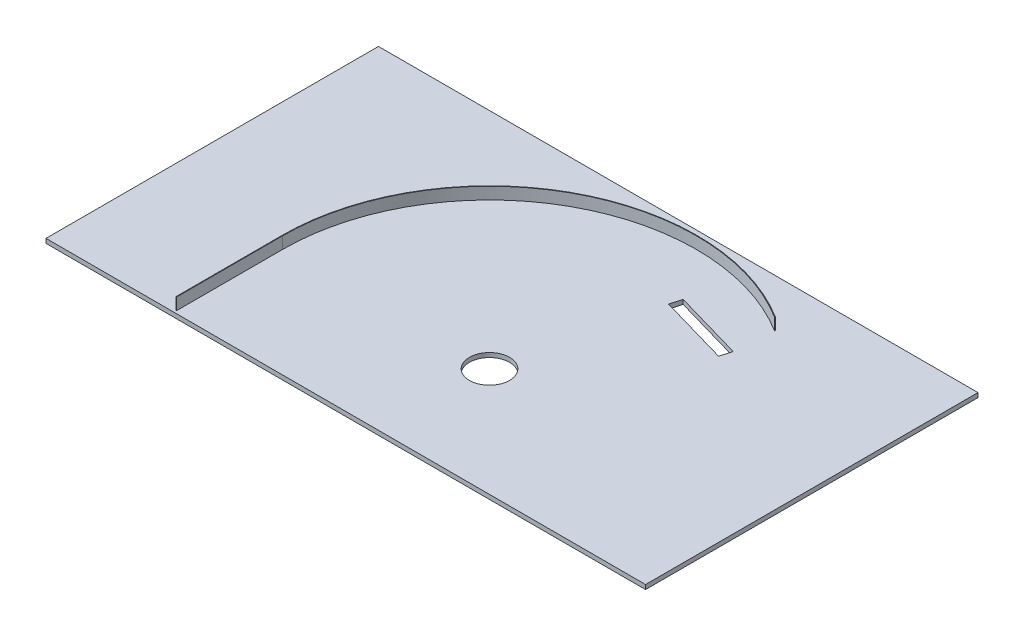
ISO-10303-21;
HEADER;
FILE_DESCRIPTION(('STEP AP214'),'2;1');
FILE_NAME('part.step','',(''),(''),'','','');
FILE_SCHEMA(('AUTOMOTIVE_DESIGN { 1 0 10303 214 1 1 1 1 }'));
ENDSEC;
DATA;
#1=APPLICATION_CONTEXT('core data for automotive mechanical design processes');
#2=APPLICATION_PROTOCOL_DEFINITION('international standard','automotive_design',2000,#1);
#3=PRODUCT_CONTEXT('',#1,'mechanical');
#4=PRODUCT('Part','Part','',(#3));
#5=PRODUCT_RELATED_PRODUCT_CATEGORY('part','',(#4));
#6=PRODUCT_DEFINITION_FORMATION('','',#4);
#7=PRODUCT_DEFINITION_CONTEXT('part definition',#1,'design');
#8=PRODUCT_DEFINITION('design','',#6,#7);
#9=PRODUCT_DEFINITION_SHAPE('','',#8);
#10=(LENGTH_UNIT() NAMED_UNIT(*) SI_UNIT(.MILLI.,.METRE.));
#11=(NAMED_UNIT(*) PLANE_ANGLE_UNIT() SI_UNIT($,.RADIAN.));
#12=(NAMED_UNIT(*) SI_UNIT($,.STERADIAN.) SOLID_ANGLE_UNIT());
#13=UNCERTAINTY_MEASURE_WITH_UNIT(LENGTH_MEASURE(1.E-05),#10,'distance_accuracy_value','');
#14=(GEOMETRIC_REPRESENTATION_CONTEXT(3) GLOBAL_UNCERTAINTY_ASSIGNED_CONTEXT((#13)) GLOBAL_UNIT_ASSIGNED_CONTEXT((#10,
#11,#12)) REPRESENTATION_CONTEXT('',''));
#15=CARTESIAN_POINT('',(0.,0.,0.));
#16=DIRECTION('',(0.,0.,1.));
#17=DIRECTION('',(1.,0.,0.));
#18=AXIS2_PLACEMENT_3D('',#15,#16,#17);
#19=CARTESIAN_POINT('',(0.,0.,0.));
#20=DIRECTION('',(0.,1.,0.));
#21=DIRECTION('',(0.,0.,1.));
#22=AXIS2_PLACEMENT_3D('',#19,#20,#21);
#23=PLANE('',#22);
#24=DIRECTION('',(0.275637355816992,0.,-0.961261695938321));
#25=VECTOR('',#24,1.);
#26=CARTESIAN_POINT('',(262.4,0.,-317.9));
#27=LINE('',#26,#25);
#28=CARTESIAN_POINT('',(262.4,0.,-317.9));
#29=VERTEX_POINT('',#28);
#30=CARTESIAN_POINT('',(270.66912067451,0.,-346.737850878149));
#31=VERTEX_POINT('',#30);
#32=EDGE_CURVE('E61',#29,#31,#27,.T.);
#33=ORIENTED_EDGE('',*,*,#32,.F.);
#34=DIRECTION('',(0.961261695938321,0.,0.275637355816993));
#35=VECTOR('',#34,1.);
#36=CARTESIAN_POINT('',(84.5665862514106,0.,-368.892910826144));
#37=LINE('',#36,#35);
#38=CARTESIAN_POINT('',(84.5665862514106,0.,-368.892910826144));
#39=VERTEX_POINT('',#38);
#40=EDGE_CURVE('E168',#39,#29,#37,.T.);
#41=ORIENTED_EDGE('',*,*,#40,.F.);
#42=DIRECTION('',(-0.275637355816993,0.,0.961261695938321));
#43=VECTOR('',#42,1.);
#44=CARTESIAN_POINT('',(92.8357069259204,0.,-397.730761704293));
#45=LINE('',#44,#43);
#46=CARTESIAN_POINT('',(92.8357069259204,0.,-397.730761704293));
#47=VERTEX_POINT('',#46);
#48=EDGE_CURVE('E172',#47,#39,#45,.T.);
#49=ORIENTED_EDGE('',*,*,#48,.F.);
#50=DIRECTION('',(-0.961261695938321,0.,-0.275637355816993));
#51=VECTOR('',#50,1.);
#52=CARTESIAN_POINT('',(270.66912067451,0.,-346.73785087815));
#53=LINE('',#52,#51);
#54=EDGE_CURVE('E181',#31,#47,#53,.T.);
#55=ORIENTED_EDGE('',*,*,#54,.F.);
#56=EDGE_LOOP('',(#33,#41,#49,#55));
#57=FACE_BOUND('',#56,.T.);
#58=CARTESIAN_POINT('',(0.,0.,0.));
#59=DIRECTION('',(0.,1.,0.));
#60=DIRECTION('',(0.,0.,1.));
#61=AXIS2_PLACEMENT_3D('',#58,#59,#60);
#62=CIRCLE('',#61,50.8);
#63=CARTESIAN_POINT('',(0.,0.,50.8));
#64=VERTEX_POINT('',#63);
#65=EDGE_CURVE('E200',#64,#64,#62,.T.);
#66=ORIENTED_EDGE('',*,*,#65,.F.);
#67=EDGE_LOOP('',(#66));
#68=FACE_BOUND('',#67,.T.);
#69=DIRECTION('',(0.,0.,1.));
#70=VECTOR('',#69,1.);
#71=CARTESIAN_POINT('',(-848.,0.,-566.7));
#72=LINE('',#71,#70);
#73=CARTESIAN_POINT('',(-848.,0.,-566.7));
#74=VERTEX_POINT('',#73);
#75=CARTESIAN_POINT('',(-848.,0.,275.4));
#76=VERTEX_POINT('',#75);
#77=EDGE_CURVE('E234',#74,#76,#72,.T.);
#78=ORIENTED_EDGE('',*,*,#77,.T.);
#79=DIRECTION('',(1.,0.,0.));
#80=VECTOR('',#79,1.);
#81=CARTESIAN_POINT('',(-848.,0.,275.4));
#82=LINE('',#81,#80);
#83=CARTESIAN_POINT('',(670.677694458201,0.,275.4));
#84=VERTEX_POINT('',#83);
#85=EDGE_CURVE('E256',#76,#84,#82,.T.);
#86=ORIENTED_EDGE('',*,*,#85,.T.);
#87=DIRECTION('',(0.,0.,-1.));
#88=VECTOR('',#87,1.);
#89=CARTESIAN_POINT('',(670.677694458201,0.,-566.7));
#90=LINE('',#89,#88);
#91=CARTESIAN_POINT('',(670.677694458201,0.,-566.7));
#92=VERTEX_POINT('',#91);
#93=EDGE_CURVE('E260',#84,#92,#90,.T.);
#94=ORIENTED_EDGE('',*,*,#93,.T.);
#95=DIRECTION('',(-1.,0.,0.));
#96=VECTOR('',#95,1.);
#97=CARTESIAN_POINT('',(-848.,0.,-566.7));
#98=LINE('',#97,#96);
#99=EDGE_CURVE('E240',#92,#74,#98,.T.);
#100=ORIENTED_EDGE('',*,*,#99,.T.);
#101=EDGE_LOOP('',(#78,#86,#94,#100));
#102=FACE_BOUND('',#101,.T.);
#103=DIRECTION('',(1.,0.,0.));
#104=VECTOR('',#103,1.);
#105=CARTESIAN_POINT('',(-525.5875,0.,269.05));
#106=LINE('',#105,#104);
#107=CARTESIAN_POINT('',(-525.5875,0.,269.05));
#108=VERTEX_POINT('',#107);
#109=CARTESIAN_POINT('',(-524.,0.,269.05));
#110=VERTEX_POINT('',#109);
#111=EDGE_CURVE('E201',#108,#110,#106,.T.);
#112=ORIENTED_EDGE('',*,*,#111,.F.);
#113=DIRECTION('',(0.,0.,-1.));
#114=VECTOR('',#113,1.);
#115=CARTESIAN_POINT('',(-525.5875,0.,299.091973241616));
#116=LINE('',#115,#114);
#117=CARTESIAN_POINT('',(-525.5875,0.,0.));
#118=VERTEX_POINT('',#117);
#119=EDGE_CURVE('E214',#108,#118,#116,.T.);
#120=ORIENTED_EDGE('',*,*,#119,.T.);
#121=CARTESIAN_POINT('',(0.,0.,0.));
#122=DIRECTION('',(0.,1.,0.));
#123=DIRECTION('',(0.,0.,1.));
#124=AXIS2_PLACEMENT_3D('',#121,#122,#123);
#125=CIRCLE('',#124,525.5875);
#126=CARTESIAN_POINT('',(277.677694458201,0.,-446.248045549365));
#127=VERTEX_POINT('',#126);
#128=EDGE_CURVE('E284',#127,#118,#125,.T.);
#129=ORIENTED_EDGE('',*,*,#128,.F.);
#130=DIRECTION('',(0.,0.,-1.));
#131=VECTOR('',#130,1.);
#132=CARTESIAN_POINT('',(277.677694458201,0.,-444.377202385966));
#133=LINE('',#132,#131);
#134=CARTESIAN_POINT('',(277.677694458201,0.,-444.377202385966));
#135=VERTEX_POINT('',#134);
#136=EDGE_CURVE('E294',#135,#127,#133,.T.);
#137=ORIENTED_EDGE('',*,*,#136,.F.);
#138=CARTESIAN_POINT('',(0.,0.,0.));
#139=DIRECTION('',(0.,-1.,0.));
#140=DIRECTION('',(0.,0.,1.));
#141=AXIS2_PLACEMENT_3D('',#138,#139,#140);
#142=CIRCLE('',#141,524.);
#143=CARTESIAN_POINT('',(-524.,0.,0.));
#144=VERTEX_POINT('',#143);
#145=EDGE_CURVE('E270',#144,#135,#142,.T.);
#146=ORIENTED_EDGE('',*,*,#145,.F.);
#147=DIRECTION('',(0.,0.,-1.));
#148=VECTOR('',#147,1.);
#149=CARTESIAN_POINT('',(-524.,0.,299.091973241616));
#150=LINE('',#149,#148);
#151=EDGE_CURVE('E217',#110,#144,#150,.T.);
#152=ORIENTED_EDGE('',*,*,#151,.F.);
#153=EDGE_LOOP('',(#112,#120,#129,#137,#146,#152));
#154=FACE_BOUND('',#153,.T.);
#155=ADVANCED_FACE('F45',(#57,#68,#102,#154),#23,.T.);
#156=CARTESIAN_POINT('',(0.,30.,0.));
#157=DIRECTION('',(0.,-1.,0.));
#158=DIRECTION('',(0.,0.,-1.));
#159=AXIS2_PLACEMENT_3D('',#156,#157,#158);
#160=CYLINDRICAL_SURFACE('',#159,524.);
#161=ORIENTED_EDGE('',*,*,#145,.T.);
#162=DIRECTION('',(0.,-1.,0.));
#163=VECTOR('',#162,1.);
#164=CARTESIAN_POINT('',(277.677694458201,30.,-444.377202385966));
#165=LINE('',#164,#163);
#166=CARTESIAN_POINT('',(277.677694458201,30.,-444.377202385966));
#167=VERTEX_POINT('',#166);
#168=EDGE_CURVE('E11',#167,#135,#165,.T.);
#169=ORIENTED_EDGE('',*,*,#168,.F.);
#170=CARTESIAN_POINT('',(0.,30.,0.));
#171=DIRECTION('',(0.,-1.,0.));
#172=DIRECTION('',(0.,0.,1.));
#173=AXIS2_PLACEMENT_3D('',#170,#171,#172);
#174=CIRCLE('',#173,524.);
#175=CARTESIAN_POINT('',(-524.,30.,0.));
#176=VERTEX_POINT('',#175);
#177=EDGE_CURVE('E279',#176,#167,#174,.T.);
#178=ORIENTED_EDGE('',*,*,#177,.F.);
#179=DIRECTION('',(0.,-1.,0.));
#180=VECTOR('',#179,1.);
#181=CARTESIAN_POINT('',(-524.,30.,0.));
#182=LINE('',#181,#180);
#183=EDGE_CURVE('E290',#176,#144,#182,.T.);
#184=ORIENTED_EDGE('',*,*,#183,.T.);
#185=EDGE_LOOP('',(#161,#169,#178,#184));
#186=FACE_BOUND('',#185,.T.);
#187=ADVANCED_FACE('F47',(#186),#160,.F.);
#188=CARTESIAN_POINT('',(277.677694458201,30.,-444.377202385966));
#189=DIRECTION('',(-1.,0.,0.));
#190=DIRECTION('',(0.,0.,1.));
#191=AXIS2_PLACEMENT_3D('',#188,#189,#190);
#192=PLANE('',#191);
#193=ORIENTED_EDGE('',*,*,#136,.T.);
#194=DIRECTION('',(0.,-1.,0.));
#195=VECTOR('',#194,1.);
#196=CARTESIAN_POINT('',(277.677694458201,30.,-446.248045549365));
#197=LINE('',#196,#195);
#198=CARTESIAN_POINT('',(277.677694458201,30.,-446.248045549365));
#199=VERTEX_POINT('',#198);
#200=EDGE_CURVE('E54',#199,#127,#197,.T.);
#201=ORIENTED_EDGE('',*,*,#200,.F.);
#202=DIRECTION('',(0.,0.,-1.));
#203=VECTOR('',#202,1.);
#204=CARTESIAN_POINT('',(277.677694458201,30.,-444.377202385966));
#205=LINE('',#204,#203);
#206=EDGE_CURVE('E283',#167,#199,#205,.T.);
#207=ORIENTED_EDGE('',*,*,#206,.F.);
#208=ORIENTED_EDGE('',*,*,#168,.T.);
#209=EDGE_LOOP('',(#193,#201,#207,#208));
#210=FACE_BOUND('',#209,.T.);
#211=ADVANCED_FACE('F315',(#210),#192,.F.);
#212=CARTESIAN_POINT('',(0.,30.,0.));
#213=DIRECTION('',(0.,-1.,0.));
#214=DIRECTION('',(0.,0.,-1.));
#215=AXIS2_PLACEMENT_3D('',#212,#213,#214);
#216=CYLINDRICAL_SURFACE('',#215,525.5875);
#217=ORIENTED_EDGE('',*,*,#128,.T.);
#218=DIRECTION('',(0.,-1.,0.));
#219=VECTOR('',#218,1.);
#220=CARTESIAN_POINT('',(-525.5875,30.,0.));
#221=LINE('',#220,#219);
#222=CARTESIAN_POINT('',(-525.5875,30.,0.));
#223=VERTEX_POINT('',#222);
#224=EDGE_CURVE('E304',#223,#118,#221,.T.);
#225=ORIENTED_EDGE('',*,*,#224,.F.);
#226=CARTESIAN_POINT('',(0.,30.,0.));
#227=DIRECTION('',(0.,1.,0.));
#228=DIRECTION('',(0.,0.,1.));
#229=AXIS2_PLACEMENT_3D('',#226,#227,#228);
#230=CIRCLE('',#229,525.5875);
#231=EDGE_CURVE('E287',#199,#223,#230,.T.);
#232=ORIENTED_EDGE('',*,*,#231,.F.);
#233=ORIENTED_EDGE('',*,*,#200,.T.);
#234=EDGE_LOOP('',(#217,#225,#232,#233));
#235=FACE_BOUND('',#234,.T.);
#236=ADVANCED_FACE('F312',(#235),#216,.T.);
#237=CARTESIAN_POINT('',(0.,30.,0.));
#238=DIRECTION('',(0.,1.,0.));
#239=DIRECTION('',(0.,0.,1.));
#240=AXIS2_PLACEMENT_3D('',#237,#238,#239);
#241=PLANE('',#240);
#242=ORIENTED_EDGE('',*,*,#177,.T.);
#243=ORIENTED_EDGE('',*,*,#206,.T.);
#244=ORIENTED_EDGE('',*,*,#231,.T.);
#245=DIRECTION('',(0.,0.,-1.));
#246=VECTOR('',#245,1.);
#247=CARTESIAN_POINT('',(-525.5875,30.,299.091973241616));
#248=LINE('',#247,#246);
#249=CARTESIAN_POINT('',(-525.5875,30.,269.05));
#250=VERTEX_POINT('',#249);
#251=EDGE_CURVE('E190',#250,#223,#248,.T.);
#252=ORIENTED_EDGE('',*,*,#251,.F.);
#253=DIRECTION('',(-1.,0.,0.));
#254=VECTOR('',#253,1.);
#255=CARTESIAN_POINT('',(-525.5875,30.,269.05));
#256=LINE('',#255,#254);
#257=CARTESIAN_POINT('',(-524.,30.,269.05));
#258=VERTEX_POINT('',#257);
#259=EDGE_CURVE('E209',#258,#250,#256,.T.);
#260=ORIENTED_EDGE('',*,*,#259,.F.);
#261=DIRECTION('',(0.,0.,-1.));
#262=VECTOR('',#261,1.);
#263=CARTESIAN_POINT('',(-524.,30.,299.091973241616));
#264=LINE('',#263,#262);
#265=EDGE_CURVE('E213',#258,#176,#264,.T.);
#266=ORIENTED_EDGE('',*,*,#265,.T.);
#267=EDGE_LOOP('',(#242,#243,#244,#252,#260,#266));
#268=FACE_BOUND('',#267,.T.);
#269=ADVANCED_FACE('F327',(#268),#241,.T.);
#270=CARTESIAN_POINT('',(-848.,-11.1125,-566.7));
#271=DIRECTION('',(-1.,0.,0.));
#272=DIRECTION('',(0.,0.,1.));
#273=AXIS2_PLACEMENT_3D('',#270,#271,#272);
#274=PLANE('',#273);
#275=ORIENTED_EDGE('',*,*,#77,.F.);
#276=DIRECTION('',(0.,1.,0.));
#277=VECTOR('',#276,1.);
#278=CARTESIAN_POINT('',(-848.,-11.1125,-566.7));
#279=LINE('',#278,#277);
#280=CARTESIAN_POINT('',(-848.,-11.1125,-566.7));
#281=VERTEX_POINT('',#280);
#282=EDGE_CURVE('E267',#281,#74,#279,.T.);
#283=ORIENTED_EDGE('',*,*,#282,.F.);
#284=DIRECTION('',(0.,0.,1.));
#285=VECTOR('',#284,1.);
#286=CARTESIAN_POINT('',(-848.,-11.1125,-566.7));
#287=LINE('',#286,#285);
#288=CARTESIAN_POINT('',(-848.,-11.1125,275.4));
#289=VERTEX_POINT('',#288);
#290=EDGE_CURVE('E235',#281,#289,#287,.T.);
#291=ORIENTED_EDGE('',*,*,#290,.T.);
#292=DIRECTION('',(0.,1.,0.));
#293=VECTOR('',#292,1.);
#294=CARTESIAN_POINT('',(-848.,-11.1125,275.4));
#295=LINE('',#294,#293);
#296=EDGE_CURVE('E252',#289,#76,#295,.T.);
#297=ORIENTED_EDGE('',*,*,#296,.T.);
#298=EDGE_LOOP('',(#275,#283,#291,#297));
#299=FACE_BOUND('',#298,.T.);
#300=ADVANCED_FACE('F357',(#299),#274,.T.);
#301=CARTESIAN_POINT('',(-848.,-11.1125,-566.7));
#302=DIRECTION('',(0.,0.,-1.));
#303=DIRECTION('',(-1.,0.,0.));
#304=AXIS2_PLACEMENT_3D('',#301,#302,#303);
#305=PLANE('',#304);
#306=ORIENTED_EDGE('',*,*,#99,.F.);
#307=DIRECTION('',(0.,1.,0.));
#308=VECTOR('',#307,1.);
#309=CARTESIAN_POINT('',(670.677694458201,-11.1125,-566.7));
#310=LINE('',#309,#308);
#311=CARTESIAN_POINT('',(670.677694458201,-11.1125,-566.7));
#312=VERTEX_POINT('',#311);
#313=EDGE_CURVE('E271',#312,#92,#310,.T.);
#314=ORIENTED_EDGE('',*,*,#313,.F.);
#315=DIRECTION('',(-1.,0.,0.));
#316=VECTOR('',#315,1.);
#317=CARTESIAN_POINT('',(-848.,-11.1125,-566.7));
#318=LINE('',#317,#316);
#319=EDGE_CURVE('E248',#312,#281,#318,.T.);
#320=ORIENTED_EDGE('',*,*,#319,.T.);
#321=ORIENTED_EDGE('',*,*,#282,.T.);
#322=EDGE_LOOP('',(#306,#314,#320,#321));
#323=FACE_BOUND('',#322,.T.);
#324=ADVANCED_FACE('F353',(#323),#305,.T.);
#325=CARTESIAN_POINT('',(670.677694458201,-11.1125,-566.7));
#326=DIRECTION('',(1.,0.,0.));
#327=DIRECTION('',(0.,0.,-1.));
#328=AXIS2_PLACEMENT_3D('',#325,#326,#327);
#329=PLANE('',#328);
#330=ORIENTED_EDGE('',*,*,#93,.F.);
#331=DIRECTION('',(0.,1.,0.));
#332=VECTOR('',#331,1.);
#333=CARTESIAN_POINT('',(670.677694458201,-11.1125,275.4));
#334=LINE('',#333,#332);
#335=CARTESIAN_POINT('',(670.677694458201,-11.1125,275.4));
#336=VERTEX_POINT('',#335);
#337=EDGE_CURVE('E274',#336,#84,#334,.T.);
#338=ORIENTED_EDGE('',*,*,#337,.F.);
#339=DIRECTION('',(0.,0.,-1.));
#340=VECTOR('',#339,1.);
#341=CARTESIAN_POINT('',(670.677694458201,-11.1125,-566.7));
#342=LINE('',#341,#340);
#343=EDGE_CURVE('E244',#336,#312,#342,.T.);
#344=ORIENTED_EDGE('',*,*,#343,.T.);
#345=ORIENTED_EDGE('',*,*,#313,.T.);
#346=EDGE_LOOP('',(#330,#338,#344,#345));
#347=FACE_BOUND('',#346,.T.);
#348=ADVANCED_FACE('F356',(#347),#329,.T.);
#349=CARTESIAN_POINT('',(-848.,-11.1125,275.4));
#350=DIRECTION('',(0.,0.,1.));
#351=DIRECTION('',(1.,0.,0.));
#352=AXIS2_PLACEMENT_3D('',#349,#350,#351);
#353=PLANE('',#352);
#354=ORIENTED_EDGE('',*,*,#85,.F.);
#355=ORIENTED_EDGE('',*,*,#296,.F.);
#356=DIRECTION('',(1.,0.,0.));
#357=VECTOR('',#356,1.);
#358=CARTESIAN_POINT('',(-848.,-11.1125,275.4));
#359=LINE('',#358,#357);
#360=EDGE_CURVE('E239',#289,#336,#359,.T.);
#361=ORIENTED_EDGE('',*,*,#360,.T.);
#362=ORIENTED_EDGE('',*,*,#337,.T.);
#363=EDGE_LOOP('',(#354,#355,#361,#362));
#364=FACE_BOUND('',#363,.T.);
#365=ADVANCED_FACE('F361',(#364),#353,.T.);
#366=CARTESIAN_POINT('',(0.,-11.1125,0.));
#367=DIRECTION('',(0.,1.,0.));
#368=DIRECTION('',(0.,0.,1.));
#369=AXIS2_PLACEMENT_3D('',#366,#367,#368);
#370=PLANE('',#369);
#371=DIRECTION('',(0.961261695938321,0.,0.275637355816993));
#372=VECTOR('',#371,1.);
#373=CARTESIAN_POINT('',(84.5665862514106,-11.1125,-368.892910826144));
#374=LINE('',#373,#372);
#375=CARTESIAN_POINT('',(84.5665862514106,-11.1125,-368.892910826144));
#376=VERTEX_POINT('',#375);
#377=CARTESIAN_POINT('',(262.4,-11.1125,-317.9));
#378=VERTEX_POINT('',#377);
#379=EDGE_CURVE('E156',#376,#378,#374,.T.);
#380=ORIENTED_EDGE('',*,*,#379,.T.);
#381=DIRECTION('',(0.275637355816992,0.,-0.961261695938321));
#382=VECTOR('',#381,1.);
#383=CARTESIAN_POINT('',(262.4,-11.1125,-317.9));
#384=LINE('',#383,#382);
#385=CARTESIAN_POINT('',(270.66912067451,-11.1125,-346.73785087815));
#386=VERTEX_POINT('',#385);
#387=EDGE_CURVE('E149',#378,#386,#384,.T.);
#388=ORIENTED_EDGE('',*,*,#387,.T.);
#389=DIRECTION('',(-0.961261695938321,0.,-0.275637355816993));
#390=VECTOR('',#389,1.);
#391=CARTESIAN_POINT('',(270.66912067451,-11.1125,-346.73785087815));
#392=LINE('',#391,#390);
#393=CARTESIAN_POINT('',(92.8357069259204,-11.1125,-397.730761704293));
#394=VERTEX_POINT('',#393);
#395=EDGE_CURVE('E159',#386,#394,#392,.T.);
#396=ORIENTED_EDGE('',*,*,#395,.T.);
#397=DIRECTION('',(-0.275637355816993,0.,0.961261695938321));
#398=VECTOR('',#397,1.);
#399=CARTESIAN_POINT('',(92.8357069259204,-11.1125,-397.730761704293));
#400=LINE('',#399,#398);
#401=EDGE_CURVE('E69',#394,#376,#400,.T.);
#402=ORIENTED_EDGE('',*,*,#401,.T.);
#403=EDGE_LOOP('',(#380,#388,#396,#402));
#404=FACE_BOUND('',#403,.T.);
#405=CARTESIAN_POINT('',(0.,-11.1125,0.));
#406=DIRECTION('',(0.,1.,0.));
#407=DIRECTION('',(0.,0.,1.));
#408=AXIS2_PLACEMENT_3D('',#405,#406,#407);
#409=CIRCLE('',#408,50.8);
#410=CARTESIAN_POINT('',(0.,-11.1125,50.8));
#411=VERTEX_POINT('',#410);
#412=EDGE_CURVE('E230',#411,#411,#409,.T.);
#413=ORIENTED_EDGE('',*,*,#412,.T.);
#414=EDGE_LOOP('',(#413));
#415=FACE_BOUND('',#414,.T.);
#416=ORIENTED_EDGE('',*,*,#290,.F.);
#417=ORIENTED_EDGE('',*,*,#319,.F.);
#418=ORIENTED_EDGE('',*,*,#343,.F.);
#419=ORIENTED_EDGE('',*,*,#360,.F.);
#420=EDGE_LOOP('',(#416,#417,#418,#419));
#421=FACE_BOUND('',#420,.T.);
#422=ADVANCED_FACE('F164',(#404,#415,#421),#370,.F.);
#423=CARTESIAN_POINT('',(0.,0.,0.));
#424=DIRECTION('',(0.,1.,0.));
#425=DIRECTION('',(0.,0.,1.));
#426=AXIS2_PLACEMENT_3D('',#423,#424,#425);
#427=CYLINDRICAL_SURFACE('',#426,50.8);
#428=ORIENTED_EDGE('',*,*,#412,.F.);
#429=EDGE_LOOP('',(#428));
#430=FACE_BOUND('',#429,.T.);
#431=ORIENTED_EDGE('',*,*,#65,.T.);
#432=EDGE_LOOP('',(#431));
#433=FACE_BOUND('',#432,.T.);
#434=ADVANCED_FACE('F339',(#430,#433),#427,.F.);
#435=CARTESIAN_POINT('',(-525.5875,30.,299.091973241616));
#436=DIRECTION('',(1.,0.,0.));
#437=DIRECTION('',(0.,0.,-1.));
#438=AXIS2_PLACEMENT_3D('',#435,#436,#437);
#439=PLANE('',#438);
#440=DIRECTION('',(0.,-1.,0.));
#441=VECTOR('',#440,1.);
#442=CARTESIAN_POINT('',(-525.5875,30.,269.05));
#443=LINE('',#442,#441);
#444=EDGE_CURVE('E205',#250,#108,#443,.T.);
#445=ORIENTED_EDGE('',*,*,#444,.F.);
#446=ORIENTED_EDGE('',*,*,#251,.T.);
#447=ORIENTED_EDGE('',*,*,#224,.T.);
#448=ORIENTED_EDGE('',*,*,#119,.F.);
#449=EDGE_LOOP('',(#445,#446,#447,#448));
#450=FACE_BOUND('',#449,.T.);
#451=ADVANCED_FACE('F321',(#450),#439,.F.);
#452=CARTESIAN_POINT('',(-524.,30.,299.091973241616));
#453=DIRECTION('',(-1.,0.,0.));
#454=DIRECTION('',(0.,0.,1.));
#455=AXIS2_PLACEMENT_3D('',#452,#453,#454);
#456=PLANE('',#455);
#457=DIRECTION('',(0.,1.,0.));
#458=VECTOR('',#457,1.);
#459=CARTESIAN_POINT('',(-524.,30.,269.05));
#460=LINE('',#459,#458);
#461=EDGE_CURVE('E196',#110,#258,#460,.T.);
#462=ORIENTED_EDGE('',*,*,#461,.F.);
#463=ORIENTED_EDGE('',*,*,#151,.T.);
#464=ORIENTED_EDGE('',*,*,#183,.F.);
#465=ORIENTED_EDGE('',*,*,#265,.F.);
#466=EDGE_LOOP('',(#462,#463,#464,#465));
#467=FACE_BOUND('',#466,.T.);
#468=ADVANCED_FACE('F331',(#467),#456,.F.);
#469=CARTESIAN_POINT('',(0.,0.,269.05));
#470=DIRECTION('',(0.,0.,1.));
#471=DIRECTION('',(1.,0.,0.));
#472=AXIS2_PLACEMENT_3D('',#469,#470,#471);
#473=PLANE('',#472);
#474=ORIENTED_EDGE('',*,*,#259,.T.);
#475=ORIENTED_EDGE('',*,*,#444,.T.);
#476=ORIENTED_EDGE('',*,*,#111,.T.);
#477=ORIENTED_EDGE('',*,*,#461,.T.);
#478=EDGE_LOOP('',(#474,#475,#476,#477));
#479=FACE_BOUND('',#478,.T.);
#480=ADVANCED_FACE('F323',(#479),#473,.T.);
#481=CARTESIAN_POINT('',(262.4,-11.1125,-317.9));
#482=DIRECTION('',(0.961261695938321,0.,0.275637355816992));
#483=DIRECTION('',(0.275637355816992,0.,-0.961261695938321));
#484=AXIS2_PLACEMENT_3D('',#481,#482,#483);
#485=PLANE('',#484);
#486=ORIENTED_EDGE('',*,*,#32,.T.);
#487=DIRECTION('',(0.,1.,0.));
#488=VECTOR('',#487,1.);
#489=CARTESIAN_POINT('',(270.66912067451,-11.1125,-346.73785087815));
#490=LINE('',#489,#488);
#491=EDGE_CURVE('E145',#386,#31,#490,.T.);
#492=ORIENTED_EDGE('',*,*,#491,.F.);
#493=ORIENTED_EDGE('',*,*,#387,.F.);
#494=DIRECTION('',(0.,1.,0.));
#495=VECTOR('',#494,1.);
#496=CARTESIAN_POINT('',(262.4,-11.1125,-317.9));
#497=LINE('',#496,#495);
#498=EDGE_CURVE('E187',#378,#29,#497,.T.);
#499=ORIENTED_EDGE('',*,*,#498,.T.);
#500=EDGE_LOOP('',(#486,#492,#493,#499));
#501=FACE_BOUND('',#500,.T.);
#502=ADVANCED_FACE('F147',(#501),#485,.F.);
#503=CARTESIAN_POINT('',(84.5665862514106,-11.1125,-368.892910826144));
#504=DIRECTION('',(-0.275637355816993,0.,0.961261695938321));
#505=DIRECTION('',(0.961261695938321,0.,0.275637355816993));
#506=AXIS2_PLACEMENT_3D('',#503,#504,#505);
#507=PLANE('',#506);
#508=ORIENTED_EDGE('',*,*,#40,.T.);
#509=ORIENTED_EDGE('',*,*,#498,.F.);
#510=ORIENTED_EDGE('',*,*,#379,.F.);
#511=DIRECTION('',(0.,1.,0.));
#512=VECTOR('',#511,1.);
#513=CARTESIAN_POINT('',(84.5665862514106,-11.1125,-368.892910826144));
#514=LINE('',#513,#512);
#515=EDGE_CURVE('E191',#376,#39,#514,.T.);
#516=ORIENTED_EDGE('',*,*,#515,.T.);
#517=EDGE_LOOP('',(#508,#509,#510,#516));
#518=FACE_BOUND('',#517,.T.);
#519=ADVANCED_FACE('F444',(#518),#507,.F.);
#520=CARTESIAN_POINT('',(92.8357069259204,-11.1125,-397.730761704293));
#521=DIRECTION('',(-0.961261695938321,0.,-0.275637355816993));
#522=DIRECTION('',(-0.275637355816993,0.,0.961261695938321));
#523=AXIS2_PLACEMENT_3D('',#520,#521,#522);
#524=PLANE('',#523);
#525=ORIENTED_EDGE('',*,*,#48,.T.);
#526=ORIENTED_EDGE('',*,*,#515,.F.);
#527=ORIENTED_EDGE('',*,*,#401,.F.);
#528=DIRECTION('',(0.,1.,0.));
#529=VECTOR('',#528,1.);
#530=CARTESIAN_POINT('',(92.8357069259204,-11.1125,-397.730761704293));
#531=LINE('',#530,#529);
#532=EDGE_CURVE('E155',#394,#47,#531,.T.);
#533=ORIENTED_EDGE('',*,*,#532,.T.);
#534=EDGE_LOOP('',(#525,#526,#527,#533));
#535=FACE_BOUND('',#534,.T.);
#536=ADVANCED_FACE('F452',(#535),#524,.F.);
#537=CARTESIAN_POINT('',(270.66912067451,-11.1125,-346.73785087815));
#538=DIRECTION('',(0.275637355816993,0.,-0.961261695938321));
#539=DIRECTION('',(-0.961261695938321,0.,-0.275637355816993));
#540=AXIS2_PLACEMENT_3D('',#537,#538,#539);
#541=PLANE('',#540);
#542=ORIENTED_EDGE('',*,*,#54,.T.);
#543=ORIENTED_EDGE('',*,*,#532,.F.);
#544=ORIENTED_EDGE('',*,*,#395,.F.);
#545=ORIENTED_EDGE('',*,*,#491,.T.);
#546=EDGE_LOOP('',(#542,#543,#544,#545));
#547=FACE_BOUND('',#546,.T.);
#548=ADVANCED_FACE('F160',(#547),#541,.F.);
#549=CLOSED_SHELL('',(#155,#187,#211,#236,#269,#300,#324,#348,#365,#422,#434,#451,#468,#480,
#502,#519,#536,#548));
#550=MANIFOLD_SOLID_BREP('B2',#549);
#551=ADVANCED_BREP_SHAPE_REPRESENTATION('',(#18,#550),#14);
#552=SHAPE_DEFINITION_REPRESENTATION(#9,#551);
ENDSEC;
END-ISO-10303-21;
